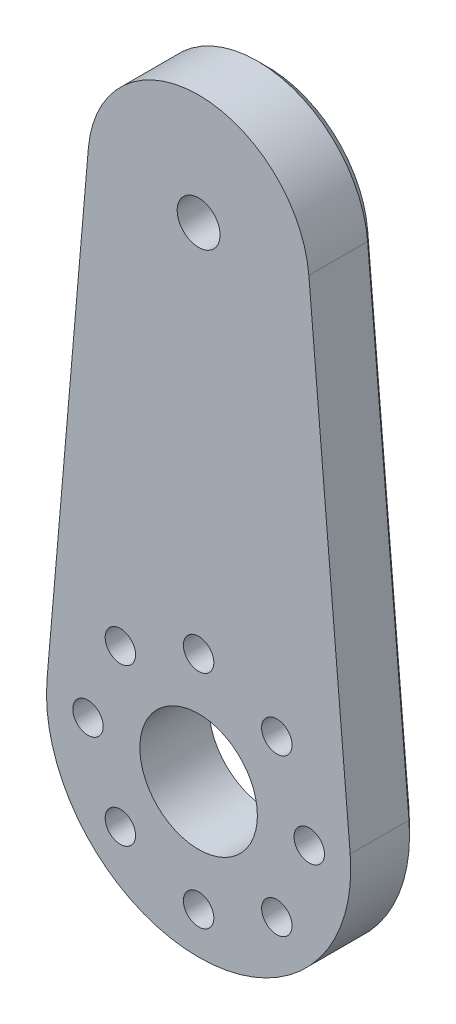
ISO-10303-21;
HEADER;
FILE_DESCRIPTION(('STEP AP214'),'2;1');
FILE_NAME('part.step','',(''),(''),'','','');
FILE_SCHEMA(('AUTOMOTIVE_DESIGN { 1 0 10303 214 1 1 1 1 }'));
ENDSEC;
DATA;
#1=APPLICATION_CONTEXT('core data for automotive mechanical design processes');
#2=APPLICATION_PROTOCOL_DEFINITION('international standard','automotive_design',2000,#1);
#3=PRODUCT_CONTEXT('',#1,'mechanical');
#4=PRODUCT('Part','Part','',(#3));
#5=PRODUCT_RELATED_PRODUCT_CATEGORY('part','',(#4));
#6=PRODUCT_DEFINITION_FORMATION('','',#4);
#7=PRODUCT_DEFINITION_CONTEXT('part definition',#1,'design');
#8=PRODUCT_DEFINITION('design','',#6,#7);
#9=PRODUCT_DEFINITION_SHAPE('','',#8);
#10=(LENGTH_UNIT() NAMED_UNIT(*) SI_UNIT(.MILLI.,.METRE.));
#11=(NAMED_UNIT(*) PLANE_ANGLE_UNIT() SI_UNIT($,.RADIAN.));
#12=(NAMED_UNIT(*) SI_UNIT($,.STERADIAN.) SOLID_ANGLE_UNIT());
#13=UNCERTAINTY_MEASURE_WITH_UNIT(LENGTH_MEASURE(1.E-05),#10,'distance_accuracy_value','');
#14=(GEOMETRIC_REPRESENTATION_CONTEXT(3) GLOBAL_UNCERTAINTY_ASSIGNED_CONTEXT((#13)) GLOBAL_UNIT_ASSIGNED_CONTEXT((#10,
#11,#12)) REPRESENTATION_CONTEXT('',''));
#15=CARTESIAN_POINT('',(0.,0.,0.));
#16=DIRECTION('',(0.,0.,1.));
#17=DIRECTION('',(1.,0.,0.));
#18=AXIS2_PLACEMENT_3D('',#15,#16,#17);
#19=CARTESIAN_POINT('',(-7.11762862032842,-19.3667607447331,5.));
#20=DIRECTION('',(0.,0.,-1.));
#21=DIRECTION('',(-1.,0.,0.));
#22=AXIS2_PLACEMENT_3D('',#19,#20,#21);
#23=CYLINDRICAL_SURFACE('',#22,1.1);
#24=CARTESIAN_POINT('',(-7.11762862032842,-19.3667607447331,5.));
#25=DIRECTION('',(0.,0.,1.));
#26=DIRECTION('',(1.,0.,0.));
#27=AXIS2_PLACEMENT_3D('',#24,#25,#26);
#28=CIRCLE('',#27,1.1);
#29=CARTESIAN_POINT('',(-6.01762862032842,-19.3667607447331,5.));
#30=VERTEX_POINT('',#29);
#31=EDGE_CURVE('E181',#30,#30,#28,.T.);
#32=ORIENTED_EDGE('',*,*,#31,.T.);
#33=EDGE_LOOP('',(#32));
#34=FACE_BOUND('',#33,.T.);
#35=CARTESIAN_POINT('',(-7.11762862032842,-19.3667607447331,2.25));
#36=DIRECTION('',(0.,0.,-1.));
#37=DIRECTION('',(-1.,0.,0.));
#38=AXIS2_PLACEMENT_3D('',#35,#36,#37);
#39=CIRCLE('',#38,1.1);
#40=CARTESIAN_POINT('',(-8.21762862032842,-19.3667607447331,2.25));
#41=VERTEX_POINT('',#40);
#42=EDGE_CURVE('E234',#41,#41,#39,.T.);
#43=ORIENTED_EDGE('',*,*,#42,.T.);
#44=EDGE_LOOP('',(#43));
#45=FACE_BOUND('',#44,.T.);
#46=ADVANCED_FACE('F35',(#34,#45),#23,.F.);
#47=CARTESIAN_POINT('',(-9.46077437083603,-25.0236149942255,5.));
#48=DIRECTION('',(0.,0.,-1.));
#49=DIRECTION('',(-1.,0.,0.));
#50=AXIS2_PLACEMENT_3D('',#47,#48,#49);
#51=CYLINDRICAL_SURFACE('',#50,1.1);
#52=CARTESIAN_POINT('',(-9.46077437083603,-25.0236149942255,5.));
#53=DIRECTION('',(0.,0.,1.));
#54=DIRECTION('',(1.,0.,0.));
#55=AXIS2_PLACEMENT_3D('',#52,#53,#54);
#56=CIRCLE('',#55,1.1);
#57=CARTESIAN_POINT('',(-8.36077437083603,-25.0236149942255,5.));
#58=VERTEX_POINT('',#57);
#59=EDGE_CURVE('E178',#58,#58,#56,.T.);
#60=ORIENTED_EDGE('',*,*,#59,.T.);
#61=EDGE_LOOP('',(#60));
#62=FACE_BOUND('',#61,.T.);
#63=CARTESIAN_POINT('',(-9.46077437083603,-25.0236149942255,2.25));
#64=DIRECTION('',(0.,0.,-1.));
#65=DIRECTION('',(-1.,0.,0.));
#66=AXIS2_PLACEMENT_3D('',#63,#64,#65);
#67=CIRCLE('',#66,1.1);
#68=CARTESIAN_POINT('',(-10.560774370836,-25.0236149942255,2.25));
#69=VERTEX_POINT('',#68);
#70=EDGE_CURVE('E231',#69,#69,#67,.T.);
#71=ORIENTED_EDGE('',*,*,#70,.T.);
#72=EDGE_LOOP('',(#71));
#73=FACE_BOUND('',#72,.T.);
#74=ADVANCED_FACE('F332',(#62,#73),#51,.F.);
#75=CARTESIAN_POINT('',(-15.1176286203284,-27.3667607447331,5.));
#76=DIRECTION('',(0.,0.,-1.));
#77=DIRECTION('',(-1.,0.,0.));
#78=AXIS2_PLACEMENT_3D('',#75,#76,#77);
#79=CYLINDRICAL_SURFACE('',#78,1.1);
#80=CARTESIAN_POINT('',(-15.1176286203284,-27.3667607447331,5.));
#81=DIRECTION('',(0.,0.,1.));
#82=DIRECTION('',(1.,0.,0.));
#83=AXIS2_PLACEMENT_3D('',#80,#81,#82);
#84=CIRCLE('',#83,1.1);
#85=CARTESIAN_POINT('',(-14.0176286203284,-27.3667607447331,5.));
#86=VERTEX_POINT('',#85);
#87=EDGE_CURVE('E175',#86,#86,#84,.T.);
#88=ORIENTED_EDGE('',*,*,#87,.T.);
#89=EDGE_LOOP('',(#88));
#90=FACE_BOUND('',#89,.T.);
#91=CARTESIAN_POINT('',(-15.1176286203284,-27.3667607447331,2.25));
#92=DIRECTION('',(0.,0.,-1.));
#93=DIRECTION('',(-1.,0.,0.));
#94=AXIS2_PLACEMENT_3D('',#91,#92,#93);
#95=CIRCLE('',#94,1.1);
#96=CARTESIAN_POINT('',(-16.2176286203284,-27.3667607447331,2.25));
#97=VERTEX_POINT('',#96);
#98=EDGE_CURVE('E228',#97,#97,#95,.T.);
#99=ORIENTED_EDGE('',*,*,#98,.T.);
#100=EDGE_LOOP('',(#99));
#101=FACE_BOUND('',#100,.T.);
#102=ADVANCED_FACE('F338',(#90,#101),#79,.F.);
#103=CARTESIAN_POINT('',(-20.7744828698208,-25.0236149942255,5.));
#104=DIRECTION('',(0.,0.,-1.));
#105=DIRECTION('',(-1.,0.,0.));
#106=AXIS2_PLACEMENT_3D('',#103,#104,#105);
#107=CYLINDRICAL_SURFACE('',#106,1.1);
#108=CARTESIAN_POINT('',(-20.7744828698208,-25.0236149942255,5.));
#109=DIRECTION('',(0.,0.,1.));
#110=DIRECTION('',(1.,0.,0.));
#111=AXIS2_PLACEMENT_3D('',#108,#109,#110);
#112=CIRCLE('',#111,1.1);
#113=CARTESIAN_POINT('',(-19.6744828698208,-25.0236149942255,5.));
#114=VERTEX_POINT('',#113);
#115=EDGE_CURVE('E172',#114,#114,#112,.T.);
#116=ORIENTED_EDGE('',*,*,#115,.T.);
#117=EDGE_LOOP('',(#116));
#118=FACE_BOUND('',#117,.T.);
#119=CARTESIAN_POINT('',(-20.7744828698208,-25.0236149942255,2.25));
#120=DIRECTION('',(0.,0.,-1.));
#121=DIRECTION('',(-1.,0.,0.));
#122=AXIS2_PLACEMENT_3D('',#119,#120,#121);
#123=CIRCLE('',#122,1.1);
#124=CARTESIAN_POINT('',(-21.8744828698208,-25.0236149942255,2.25));
#125=VERTEX_POINT('',#124);
#126=EDGE_CURVE('E225',#125,#125,#123,.T.);
#127=ORIENTED_EDGE('',*,*,#126,.T.);
#128=EDGE_LOOP('',(#127));
#129=FACE_BOUND('',#128,.T.);
#130=ADVANCED_FACE('F724',(#118,#129),#107,.F.);
#131=CARTESIAN_POINT('',(-23.1176286203284,-19.3667607447331,5.));
#132=DIRECTION('',(0.,0.,-1.));
#133=DIRECTION('',(-1.,0.,0.));
#134=AXIS2_PLACEMENT_3D('',#131,#132,#133);
#135=CYLINDRICAL_SURFACE('',#134,1.1);
#136=CARTESIAN_POINT('',(-23.1176286203284,-19.3667607447331,5.));
#137=DIRECTION('',(0.,0.,1.));
#138=DIRECTION('',(1.,0.,0.));
#139=AXIS2_PLACEMENT_3D('',#136,#137,#138);
#140=CIRCLE('',#139,1.1);
#141=CARTESIAN_POINT('',(-22.0176286203284,-19.3667607447331,5.));
#142=VERTEX_POINT('',#141);
#143=EDGE_CURVE('E169',#142,#142,#140,.T.);
#144=ORIENTED_EDGE('',*,*,#143,.T.);
#145=EDGE_LOOP('',(#144));
#146=FACE_BOUND('',#145,.T.);
#147=CARTESIAN_POINT('',(-23.1176286203284,-19.3667607447331,2.25));
#148=DIRECTION('',(0.,0.,-1.));
#149=DIRECTION('',(-1.,0.,0.));
#150=AXIS2_PLACEMENT_3D('',#147,#148,#149);
#151=CIRCLE('',#150,1.1);
#152=CARTESIAN_POINT('',(-24.2176286203284,-19.3667607447331,2.25));
#153=VERTEX_POINT('',#152);
#154=EDGE_CURVE('E222',#153,#153,#151,.T.);
#155=ORIENTED_EDGE('',*,*,#154,.T.);
#156=EDGE_LOOP('',(#155));
#157=FACE_BOUND('',#156,.T.);
#158=ADVANCED_FACE('F733',(#146,#157),#135,.F.);
#159=CARTESIAN_POINT('',(-20.7744828698208,-13.7099064952407,5.));
#160=DIRECTION('',(0.,0.,-1.));
#161=DIRECTION('',(-1.,0.,0.));
#162=AXIS2_PLACEMENT_3D('',#159,#160,#161);
#163=CYLINDRICAL_SURFACE('',#162,1.1);
#164=CARTESIAN_POINT('',(-20.7744828698208,-13.7099064952407,5.));
#165=DIRECTION('',(0.,0.,1.));
#166=DIRECTION('',(1.,0.,0.));
#167=AXIS2_PLACEMENT_3D('',#164,#165,#166);
#168=CIRCLE('',#167,1.1);
#169=CARTESIAN_POINT('',(-19.6744828698208,-13.7099064952407,5.));
#170=VERTEX_POINT('',#169);
#171=EDGE_CURVE('E166',#170,#170,#168,.T.);
#172=ORIENTED_EDGE('',*,*,#171,.T.);
#173=EDGE_LOOP('',(#172));
#174=FACE_BOUND('',#173,.T.);
#175=CARTESIAN_POINT('',(-20.7744828698208,-13.7099064952407,2.25));
#176=DIRECTION('',(0.,0.,-1.));
#177=DIRECTION('',(-1.,0.,0.));
#178=AXIS2_PLACEMENT_3D('',#175,#176,#177);
#179=CIRCLE('',#178,1.1);
#180=CARTESIAN_POINT('',(-21.8744828698208,-13.7099064952407,2.25));
#181=VERTEX_POINT('',#180);
#182=EDGE_CURVE('E219',#181,#181,#179,.T.);
#183=ORIENTED_EDGE('',*,*,#182,.T.);
#184=EDGE_LOOP('',(#183));
#185=FACE_BOUND('',#184,.T.);
#186=ADVANCED_FACE('F743',(#174,#185),#163,.F.);
#187=CARTESIAN_POINT('',(-15.1176286203284,-11.3667607447331,5.));
#188=DIRECTION('',(0.,0.,-1.));
#189=DIRECTION('',(-1.,0.,0.));
#190=AXIS2_PLACEMENT_3D('',#187,#188,#189);
#191=CYLINDRICAL_SURFACE('',#190,1.1);
#192=CARTESIAN_POINT('',(-15.1176286203284,-11.3667607447331,5.));
#193=DIRECTION('',(0.,0.,1.));
#194=DIRECTION('',(1.,0.,0.));
#195=AXIS2_PLACEMENT_3D('',#192,#193,#194);
#196=CIRCLE('',#195,1.1);
#197=CARTESIAN_POINT('',(-14.0176286203284,-11.3667607447331,5.));
#198=VERTEX_POINT('',#197);
#199=EDGE_CURVE('E163',#198,#198,#196,.T.);
#200=ORIENTED_EDGE('',*,*,#199,.T.);
#201=EDGE_LOOP('',(#200));
#202=FACE_BOUND('',#201,.T.);
#203=CARTESIAN_POINT('',(-15.1176286203284,-11.3667607447331,2.25));
#204=DIRECTION('',(0.,0.,-1.));
#205=DIRECTION('',(-1.,0.,0.));
#206=AXIS2_PLACEMENT_3D('',#203,#204,#205);
#207=CIRCLE('',#206,1.1);
#208=CARTESIAN_POINT('',(-16.2176286203284,-11.3667607447331,2.25));
#209=VERTEX_POINT('',#208);
#210=EDGE_CURVE('E215',#209,#209,#207,.T.);
#211=ORIENTED_EDGE('',*,*,#210,.T.);
#212=EDGE_LOOP('',(#211));
#213=FACE_BOUND('',#212,.T.);
#214=ADVANCED_FACE('F418',(#202,#213),#191,.F.);
#215=CARTESIAN_POINT('',(-9.46077437083604,-13.7099064952407,5.));
#216=DIRECTION('',(0.,0.,-1.));
#217=DIRECTION('',(-1.,0.,0.));
#218=AXIS2_PLACEMENT_3D('',#215,#216,#217);
#219=CYLINDRICAL_SURFACE('',#218,1.1);
#220=CARTESIAN_POINT('',(-9.46077437083604,-13.7099064952407,5.));
#221=DIRECTION('',(0.,0.,1.));
#222=DIRECTION('',(1.,0.,0.));
#223=AXIS2_PLACEMENT_3D('',#220,#221,#222);
#224=CIRCLE('',#223,1.1);
#225=CARTESIAN_POINT('',(-8.36077437083604,-13.7099064952407,5.));
#226=VERTEX_POINT('',#225);
#227=EDGE_CURVE('E155',#226,#226,#224,.T.);
#228=ORIENTED_EDGE('',*,*,#227,.T.);
#229=EDGE_LOOP('',(#228));
#230=FACE_BOUND('',#229,.T.);
#231=CARTESIAN_POINT('',(-9.46077437083604,-13.7099064952407,2.25));
#232=DIRECTION('',(0.,0.,-1.));
#233=DIRECTION('',(-1.,0.,0.));
#234=AXIS2_PLACEMENT_3D('',#231,#232,#233);
#235=CIRCLE('',#234,1.1);
#236=CARTESIAN_POINT('',(-10.560774370836,-13.7099064952407,2.25));
#237=VERTEX_POINT('',#236);
#238=EDGE_CURVE('E212',#237,#237,#235,.T.);
#239=ORIENTED_EDGE('',*,*,#238,.T.);
#240=EDGE_LOOP('',(#239));
#241=FACE_BOUND('',#240,.T.);
#242=ADVANCED_FACE('F360',(#230,#241),#219,.F.);
#243=CARTESIAN_POINT('',(-15.1176286203284,15.6332392552669,0.));
#244=DIRECTION('',(0.,0.,1.));
#245=DIRECTION('',(1.,0.,0.));
#246=AXIS2_PLACEMENT_3D('',#243,#244,#245);
#247=PLANE('',#246);
#248=CARTESIAN_POINT('',(-15.1176286203284,-19.3667607447331,0.));
#249=DIRECTION('',(0.,0.,1.));
#250=DIRECTION('',(1.,0.,0.));
#251=AXIS2_PLACEMENT_3D('',#248,#249,#250);
#252=CIRCLE('',#251,10.25);
#253=CARTESIAN_POINT('',(-4.90535109546171,-18.4881893161617,0.));
#254=VERTEX_POINT('',#253);
#255=CARTESIAN_POINT('',(-25.3299061451951,-18.4881893161617,0.));
#256=VERTEX_POINT('',#255);
#257=EDGE_CURVE('E244',#254,#256,#252,.F.);
#258=ORIENTED_EDGE('',*,*,#257,.T.);
#259=DIRECTION('',(0.0857142857142855,0.996319758523583,0.));
#260=VECTOR('',#259,1.);
#261=CARTESIAN_POINT('',(-22.3409468696244,16.2546678266955,0.));
#262=LINE('',#261,#260);
#263=CARTESIAN_POINT('',(-22.3409468696244,16.2546678266955,0.));
#264=VERTEX_POINT('',#263);
#265=EDGE_CURVE('E246',#256,#264,#262,.T.);
#266=ORIENTED_EDGE('',*,*,#265,.T.);
#267=CARTESIAN_POINT('',(-15.1176286203284,15.6332392552669,0.));
#268=DIRECTION('',(0.,0.,1.));
#269=DIRECTION('',(1.,0.,0.));
#270=AXIS2_PLACEMENT_3D('',#267,#268,#269);
#271=CIRCLE('',#270,7.24999999999999);
#272=CARTESIAN_POINT('',(-7.89431037103246,16.2546678266955,0.));
#273=VERTEX_POINT('',#272);
#274=EDGE_CURVE('E242',#264,#273,#271,.F.);
#275=ORIENTED_EDGE('',*,*,#274,.T.);
#276=DIRECTION('',(0.0857142857142858,-0.996319758523583,0.));
#277=VECTOR('',#276,1.);
#278=CARTESIAN_POINT('',(-7.89431037103246,16.2546678266955,0.));
#279=LINE('',#278,#277);
#280=EDGE_CURVE('E240',#273,#254,#279,.T.);
#281=ORIENTED_EDGE('',*,*,#280,.T.);
#282=EDGE_LOOP('',(#258,#266,#275,#281));
#283=FACE_BOUND('',#282,.T.);
#284=CARTESIAN_POINT('',(-20.7744828698208,-13.7099064952407,0.));
#285=DIRECTION('',(0.,0.,-1.));
#286=DIRECTION('',(-1.,0.,0.));
#287=AXIS2_PLACEMENT_3D('',#284,#285,#286);
#288=CIRCLE('',#287,1.75);
#289=CARTESIAN_POINT('',(-22.5244828698208,-13.7099064952407,0.));
#290=VERTEX_POINT('',#289);
#291=EDGE_CURVE('E260',#290,#290,#288,.T.);
#292=ORIENTED_EDGE('',*,*,#291,.F.);
#293=EDGE_LOOP('',(#292));
#294=FACE_BOUND('',#293,.T.);
#295=CARTESIAN_POINT('',(-15.1176286203284,-11.3667607447331,0.));
#296=DIRECTION('',(0.,0.,-1.));
#297=DIRECTION('',(-1.,0.,0.));
#298=AXIS2_PLACEMENT_3D('',#295,#296,#297);
#299=CIRCLE('',#298,1.75);
#300=CARTESIAN_POINT('',(-16.8676286203284,-11.3667607447331,0.));
#301=VERTEX_POINT('',#300);
#302=EDGE_CURVE('E271',#301,#301,#299,.T.);
#303=ORIENTED_EDGE('',*,*,#302,.F.);
#304=EDGE_LOOP('',(#303));
#305=FACE_BOUND('',#304,.T.);
#306=CARTESIAN_POINT('',(-9.46077437083604,-13.7099064952407,0.));
#307=DIRECTION('',(0.,0.,-1.));
#308=DIRECTION('',(-1.,0.,0.));
#309=AXIS2_PLACEMENT_3D('',#306,#307,#308);
#310=CIRCLE('',#309,1.75);
#311=CARTESIAN_POINT('',(-11.210774370836,-13.7099064952407,0.));
#312=VERTEX_POINT('',#311);
#313=EDGE_CURVE('E433',#312,#312,#310,.T.);
#314=ORIENTED_EDGE('',*,*,#313,.F.);
#315=EDGE_LOOP('',(#314));
#316=FACE_BOUND('',#315,.T.);
#317=CARTESIAN_POINT('',(-7.11762862032842,-19.3667607447331,0.));
#318=DIRECTION('',(0.,0.,-1.));
#319=DIRECTION('',(-1.,0.,0.));
#320=AXIS2_PLACEMENT_3D('',#317,#318,#319);
#321=CIRCLE('',#320,1.75);
#322=CARTESIAN_POINT('',(-8.86762862032842,-19.3667607447331,0.));
#323=VERTEX_POINT('',#322);
#324=EDGE_CURVE('E432',#323,#323,#321,.T.);
#325=ORIENTED_EDGE('',*,*,#324,.F.);
#326=EDGE_LOOP('',(#325));
#327=FACE_BOUND('',#326,.T.);
#328=CARTESIAN_POINT('',(-9.46077437083603,-25.0236149942255,0.));
#329=DIRECTION('',(0.,0.,-1.));
#330=DIRECTION('',(-1.,0.,0.));
#331=AXIS2_PLACEMENT_3D('',#328,#329,#330);
#332=CIRCLE('',#331,1.75);
#333=CARTESIAN_POINT('',(-11.210774370836,-25.0236149942255,0.));
#334=VERTEX_POINT('',#333);
#335=EDGE_CURVE('E456',#334,#334,#332,.T.);
#336=ORIENTED_EDGE('',*,*,#335,.F.);
#337=EDGE_LOOP('',(#336));
#338=FACE_BOUND('',#337,.T.);
#339=CARTESIAN_POINT('',(-15.1176286203284,-27.3667607447331,0.));
#340=DIRECTION('',(0.,0.,-1.));
#341=DIRECTION('',(-1.,0.,0.));
#342=AXIS2_PLACEMENT_3D('',#339,#340,#341);
#343=CIRCLE('',#342,1.75);
#344=CARTESIAN_POINT('',(-16.8676286203284,-27.3667607447331,0.));
#345=VERTEX_POINT('',#344);
#346=EDGE_CURVE('E460',#345,#345,#343,.T.);
#347=ORIENTED_EDGE('',*,*,#346,.F.);
#348=EDGE_LOOP('',(#347));
#349=FACE_BOUND('',#348,.T.);
#350=CARTESIAN_POINT('',(-20.7744828698208,-25.0236149942255,0.));
#351=DIRECTION('',(0.,0.,-1.));
#352=DIRECTION('',(-1.,0.,0.));
#353=AXIS2_PLACEMENT_3D('',#350,#351,#352);
#354=CIRCLE('',#353,1.74999999999999);
#355=CARTESIAN_POINT('',(-22.5244828698208,-25.0236149942255,0.));
#356=VERTEX_POINT('',#355);
#357=EDGE_CURVE('E464',#356,#356,#354,.T.);
#358=ORIENTED_EDGE('',*,*,#357,.F.);
#359=EDGE_LOOP('',(#358));
#360=FACE_BOUND('',#359,.T.);
#361=CARTESIAN_POINT('',(-23.1176286203284,-19.3667607447331,0.));
#362=DIRECTION('',(0.,0.,-1.));
#363=DIRECTION('',(-1.,0.,0.));
#364=AXIS2_PLACEMENT_3D('',#361,#362,#363);
#365=CIRCLE('',#364,1.75);
#366=CARTESIAN_POINT('',(-24.8676286203284,-19.3667607447331,0.));
#367=VERTEX_POINT('',#366);
#368=EDGE_CURVE('E277',#367,#367,#365,.T.);
#369=ORIENTED_EDGE('',*,*,#368,.F.);
#370=EDGE_LOOP('',(#369));
#371=FACE_BOUND('',#370,.T.);
#372=CARTESIAN_POINT('',(-15.1176286203284,-19.3667607447331,0.));
#373=DIRECTION('',(0.,0.,1.));
#374=DIRECTION('',(1.,0.,0.));
#375=AXIS2_PLACEMENT_3D('',#372,#373,#374);
#376=CIRCLE('',#375,4.25);
#377=CARTESIAN_POINT('',(-10.8676286203284,-19.3667607447331,0.));
#378=VERTEX_POINT('',#377);
#379=EDGE_CURVE('E184',#378,#378,#376,.T.);
#380=ORIENTED_EDGE('',*,*,#379,.T.);
#381=EDGE_LOOP('',(#380));
#382=FACE_BOUND('',#381,.T.);
#383=DIRECTION('',(1.,0.,0.));
#384=VECTOR('',#383,1.);
#385=CARTESIAN_POINT('',(-16.7053418605999,12.8832392552669,0.));
#386=LINE('',#385,#384);
#387=CARTESIAN_POINT('',(-16.7053418605999,12.8832392552669,0.));
#388=VERTEX_POINT('',#387);
#389=CARTESIAN_POINT('',(-13.529915380057,12.8832392552669,0.));
#390=VERTEX_POINT('',#389);
#391=EDGE_CURVE('E237',#388,#390,#386,.T.);
#392=ORIENTED_EDGE('',*,*,#391,.T.);
#393=DIRECTION('',(0.5,0.866025403784439,0.));
#394=VECTOR('',#393,1.);
#395=CARTESIAN_POINT('',(-13.529915380057,12.8832392552669,0.));
#396=LINE('',#395,#394);
#397=CARTESIAN_POINT('',(-11.9422021397855,15.6332392552669,0.));
#398=VERTEX_POINT('',#397);
#399=EDGE_CURVE('E150',#390,#398,#396,.T.);
#400=ORIENTED_EDGE('',*,*,#399,.T.);
#401=DIRECTION('',(-0.5,0.866025403784439,0.));
#402=VECTOR('',#401,1.);
#403=CARTESIAN_POINT('',(-11.9422021397855,15.6332392552669,0.));
#404=LINE('',#403,#402);
#405=CARTESIAN_POINT('',(-13.529915380057,18.3832392552669,0.));
#406=VERTEX_POINT('',#405);
#407=EDGE_CURVE('E290',#398,#406,#404,.T.);
#408=ORIENTED_EDGE('',*,*,#407,.T.);
#409=DIRECTION('',(-1.,0.,0.));
#410=VECTOR('',#409,1.);
#411=CARTESIAN_POINT('',(-13.529915380057,18.3832392552669,0.));
#412=LINE('',#411,#410);
#413=CARTESIAN_POINT('',(-16.7053418605999,18.3832392552669,0.));
#414=VERTEX_POINT('',#413);
#415=EDGE_CURVE('E293',#406,#414,#412,.T.);
#416=ORIENTED_EDGE('',*,*,#415,.T.);
#417=DIRECTION('',(-0.5,-0.866025403784439,0.));
#418=VECTOR('',#417,1.);
#419=CARTESIAN_POINT('',(-16.7053418605999,18.3832392552669,0.));
#420=LINE('',#419,#418);
#421=CARTESIAN_POINT('',(-18.2930551008714,15.6332392552669,0.));
#422=VERTEX_POINT('',#421);
#423=EDGE_CURVE('E296',#414,#422,#420,.T.);
#424=ORIENTED_EDGE('',*,*,#423,.T.);
#425=DIRECTION('',(0.500000000000001,-0.866025403784438,0.));
#426=VECTOR('',#425,1.);
#427=CARTESIAN_POINT('',(-18.2930551008714,15.6332392552669,0.));
#428=LINE('',#427,#426);
#429=EDGE_CURVE('E146',#422,#388,#428,.T.);
#430=ORIENTED_EDGE('',*,*,#429,.T.);
#431=EDGE_LOOP('',(#392,#400,#408,#416,#424,#430));
#432=FACE_BOUND('',#431,.T.);
#433=ADVANCED_FACE('F315',(#283,#294,#305,#316,#327,#338,#349,#360,#371,#382,#432),#247,.F.);
#434=CARTESIAN_POINT('',(-15.1176286203284,15.6332392552669,5.));
#435=DIRECTION('',(0.,0.,1.));
#436=DIRECTION('',(1.,0.,0.));
#437=AXIS2_PLACEMENT_3D('',#434,#435,#436);
#438=PLANE('',#437);
#439=ORIENTED_EDGE('',*,*,#199,.F.);
#440=EDGE_LOOP('',(#439));
#441=FACE_BOUND('',#440,.T.);
#442=ORIENTED_EDGE('',*,*,#143,.F.);
#443=EDGE_LOOP('',(#442));
#444=FACE_BOUND('',#443,.T.);
#445=ORIENTED_EDGE('',*,*,#87,.F.);
#446=EDGE_LOOP('',(#445));
#447=FACE_BOUND('',#446,.T.);
#448=ORIENTED_EDGE('',*,*,#31,.F.);
#449=EDGE_LOOP('',(#448));
#450=FACE_BOUND('',#449,.T.);
#451=CARTESIAN_POINT('',(-15.1176286203284,15.6332392552669,5.));
#452=DIRECTION('',(0.,0.,1.));
#453=DIRECTION('',(1.,0.,0.));
#454=AXIS2_PLACEMENT_3D('',#451,#452,#453);
#455=CIRCLE('',#454,1.55);
#456=CARTESIAN_POINT('',(-13.5676286203284,15.6332392552669,5.));
#457=VERTEX_POINT('',#456);
#458=EDGE_CURVE('E188',#457,#457,#455,.T.);
#459=ORIENTED_EDGE('',*,*,#458,.F.);
#460=EDGE_LOOP('',(#459));
#461=FACE_BOUND('',#460,.T.);
#462=CARTESIAN_POINT('',(-15.1176286203284,15.6332392552669,5.));
#463=DIRECTION('',(0.,0.,1.));
#464=DIRECTION('',(1.,0.,0.));
#465=AXIS2_PLACEMENT_3D('',#462,#463,#464);
#466=CIRCLE('',#465,8.);
#467=CARTESIAN_POINT('',(-7.14707055213976,16.3189535409812,5.));
#468=VERTEX_POINT('',#467);
#469=CARTESIAN_POINT('',(-23.0881866885171,16.3189535409812,5.));
#470=VERTEX_POINT('',#469);
#471=EDGE_CURVE('E193',#468,#470,#466,.T.);
#472=ORIENTED_EDGE('',*,*,#471,.T.);
#473=DIRECTION('',(-0.0857142857142855,-0.996319758523583,0.));
#474=VECTOR('',#473,1.);
#475=CARTESIAN_POINT('',(-23.0881866885171,16.3189535409812,5.));
#476=LINE('',#475,#474);
#477=CARTESIAN_POINT('',(-26.0771459640878,-18.4239036018759,5.));
#478=VERTEX_POINT('',#477);
#479=EDGE_CURVE('E196',#470,#478,#476,.T.);
#480=ORIENTED_EDGE('',*,*,#479,.T.);
#481=CARTESIAN_POINT('',(-15.1176286203284,-19.3667607447331,5.));
#482=DIRECTION('',(0.,0.,1.));
#483=DIRECTION('',(1.,0.,0.));
#484=AXIS2_PLACEMENT_3D('',#481,#482,#483);
#485=CIRCLE('',#484,11.);
#486=CARTESIAN_POINT('',(-4.15811127656901,-18.4239036018759,5.));
#487=VERTEX_POINT('',#486);
#488=EDGE_CURVE('E198',#478,#487,#485,.T.);
#489=ORIENTED_EDGE('',*,*,#488,.T.);
#490=DIRECTION('',(-0.0857142857142858,0.996319758523583,0.));
#491=VECTOR('',#490,1.);
#492=CARTESIAN_POINT('',(-7.14707055213976,16.3189535409812,5.));
#493=LINE('',#492,#491);
#494=EDGE_CURVE('E200',#487,#468,#493,.T.);
#495=ORIENTED_EDGE('',*,*,#494,.T.);
#496=EDGE_LOOP('',(#472,#480,#489,#495));
#497=FACE_BOUND('',#496,.T.);
#498=CARTESIAN_POINT('',(-15.1176286203284,-19.3667607447331,5.));
#499=DIRECTION('',(0.,0.,1.));
#500=DIRECTION('',(1.,0.,0.));
#501=AXIS2_PLACEMENT_3D('',#498,#499,#500);
#502=CIRCLE('',#501,4.25);
#503=CARTESIAN_POINT('',(-10.8676286203284,-19.3667607447331,5.));
#504=VERTEX_POINT('',#503);
#505=EDGE_CURVE('E185',#504,#504,#502,.T.);
#506=ORIENTED_EDGE('',*,*,#505,.F.);
#507=EDGE_LOOP('',(#506));
#508=FACE_BOUND('',#507,.T.);
#509=ORIENTED_EDGE('',*,*,#59,.F.);
#510=EDGE_LOOP('',(#509));
#511=FACE_BOUND('',#510,.T.);
#512=ORIENTED_EDGE('',*,*,#115,.F.);
#513=EDGE_LOOP('',(#512));
#514=FACE_BOUND('',#513,.T.);
#515=ORIENTED_EDGE('',*,*,#171,.F.);
#516=EDGE_LOOP('',(#515));
#517=FACE_BOUND('',#516,.T.);
#518=ORIENTED_EDGE('',*,*,#227,.F.);
#519=EDGE_LOOP('',(#518));
#520=FACE_BOUND('',#519,.T.);
#521=ADVANCED_FACE('F353',(#441,#444,#447,#450,#461,#497,#508,#511,#514,#517,#520),#438,.T.);
#522=CARTESIAN_POINT('',(-15.1176286203284,15.6332392552669,5.));
#523=DIRECTION('',(0.,0.,-1.));
#524=DIRECTION('',(-1.,0.,0.));
#525=AXIS2_PLACEMENT_3D('',#522,#523,#524);
#526=CYLINDRICAL_SURFACE('',#525,8.);
#527=DIRECTION('',(0.,0.,-1.));
#528=VECTOR('',#527,1.);
#529=CARTESIAN_POINT('',(-7.14707055213976,16.3189535409812,5.));
#530=LINE('',#529,#528);
#531=CARTESIAN_POINT('',(-7.14707055213976,16.3189535409812,0.750000000000001));
#532=VERTEX_POINT('',#531);
#533=EDGE_CURVE('E202',#468,#532,#530,.T.);
#534=ORIENTED_EDGE('',*,*,#533,.T.);
#535=CARTESIAN_POINT('',(-15.1176286203284,15.6332392552669,0.750000000000001));
#536=DIRECTION('',(0.,0.,1.));
#537=DIRECTION('',(1.,0.,0.));
#538=AXIS2_PLACEMENT_3D('',#535,#536,#537);
#539=CIRCLE('',#538,8.);
#540=CARTESIAN_POINT('',(-23.0881866885171,16.3189535409812,0.750000000000001));
#541=VERTEX_POINT('',#540);
#542=EDGE_CURVE('E44',#532,#541,#539,.T.);
#543=ORIENTED_EDGE('',*,*,#542,.T.);
#544=DIRECTION('',(0.,0.,-1.));
#545=VECTOR('',#544,1.);
#546=CARTESIAN_POINT('',(-23.0881866885171,16.3189535409812,5.));
#547=LINE('',#546,#545);
#548=EDGE_CURVE('E208',#470,#541,#547,.T.);
#549=ORIENTED_EDGE('',*,*,#548,.F.);
#550=ORIENTED_EDGE('',*,*,#471,.F.);
#551=EDGE_LOOP('',(#534,#543,#549,#550));
#552=FACE_BOUND('',#551,.T.);
#553=ADVANCED_FACE('F356',(#552),#526,.T.);
#554=CARTESIAN_POINT('',(-23.0881866885171,16.3189535409812,5.));
#555=DIRECTION('',(0.996319758523583,-0.0857142857142855,0.));
#556=DIRECTION('',(0.0857142857142855,0.996319758523583,0.));
#557=AXIS2_PLACEMENT_3D('',#554,#555,#556);
#558=PLANE('',#557);
#559=ORIENTED_EDGE('',*,*,#548,.T.);
#560=DIRECTION('',(-0.0857142857142855,-0.996319758523583,0.));
#561=VECTOR('',#560,1.);
#562=CARTESIAN_POINT('',(-23.0881866885171,16.3189535409812,0.750000000000002));
#563=LINE('',#562,#561);
#564=CARTESIAN_POINT('',(-26.0771459640878,-18.4239036018759,0.750000000000001));
#565=VERTEX_POINT('',#564);
#566=EDGE_CURVE('E210',#541,#565,#563,.T.);
#567=ORIENTED_EDGE('',*,*,#566,.T.);
#568=DIRECTION('',(0.,0.,-1.));
#569=VECTOR('',#568,1.);
#570=CARTESIAN_POINT('',(-26.0771459640878,-18.4239036018759,5.));
#571=LINE('',#570,#569);
#572=EDGE_CURVE('E206',#478,#565,#571,.T.);
#573=ORIENTED_EDGE('',*,*,#572,.F.);
#574=ORIENTED_EDGE('',*,*,#479,.F.);
#575=EDGE_LOOP('',(#559,#567,#573,#574));
#576=FACE_BOUND('',#575,.T.);
#577=ADVANCED_FACE('F367',(#576),#558,.F.);
#578=CARTESIAN_POINT('',(-15.1176286203284,-19.3667607447331,5.));
#579=DIRECTION('',(0.,0.,-1.));
#580=DIRECTION('',(-1.,0.,0.));
#581=AXIS2_PLACEMENT_3D('',#578,#579,#580);
#582=CYLINDRICAL_SURFACE('',#581,11.);
#583=ORIENTED_EDGE('',*,*,#572,.T.);
#584=CARTESIAN_POINT('',(-15.1176286203284,-19.3667607447331,0.750000000000001));
#585=DIRECTION('',(0.,0.,1.));
#586=DIRECTION('',(1.,0.,0.));
#587=AXIS2_PLACEMENT_3D('',#584,#585,#586);
#588=CIRCLE('',#587,11.);
#589=CARTESIAN_POINT('',(-4.15811127656901,-18.4239036018759,0.750000000000001));
#590=VERTEX_POINT('',#589);
#591=EDGE_CURVE('E58',#565,#590,#588,.T.);
#592=ORIENTED_EDGE('',*,*,#591,.T.);
#593=DIRECTION('',(0.,0.,-1.));
#594=VECTOR('',#593,1.);
#595=CARTESIAN_POINT('',(-4.15811127656901,-18.4239036018759,5.));
#596=LINE('',#595,#594);
#597=EDGE_CURVE('E204',#487,#590,#596,.T.);
#598=ORIENTED_EDGE('',*,*,#597,.F.);
#599=ORIENTED_EDGE('',*,*,#488,.F.);
#600=EDGE_LOOP('',(#583,#592,#598,#599));
#601=FACE_BOUND('',#600,.T.);
#602=ADVANCED_FACE('F364',(#601),#582,.T.);
#603=CARTESIAN_POINT('',(-7.14707055213976,16.3189535409812,5.));
#604=DIRECTION('',(-0.996319758523583,-0.0857142857142858,0.));
#605=DIRECTION('',(0.0857142857142858,-0.996319758523583,0.));
#606=AXIS2_PLACEMENT_3D('',#603,#604,#605);
#607=PLANE('',#606);
#608=ORIENTED_EDGE('',*,*,#597,.T.);
#609=DIRECTION('',(-0.0857142857142858,0.996319758523583,0.));
#610=VECTOR('',#609,1.);
#611=CARTESIAN_POINT('',(-7.14707055213976,16.3189535409812,0.750000000000001));
#612=LINE('',#611,#610);
#613=EDGE_CURVE('E11',#590,#532,#612,.T.);
#614=ORIENTED_EDGE('',*,*,#613,.T.);
#615=ORIENTED_EDGE('',*,*,#533,.F.);
#616=ORIENTED_EDGE('',*,*,#494,.F.);
#617=EDGE_LOOP('',(#608,#614,#615,#616));
#618=FACE_BOUND('',#617,.T.);
#619=ADVANCED_FACE('F351',(#618),#607,.F.);
#620=CARTESIAN_POINT('',(-15.1176286203284,15.6332392552669,5.));
#621=DIRECTION('',(0.,0.,-1.));
#622=DIRECTION('',(-1.,0.,0.));
#623=AXIS2_PLACEMENT_3D('',#620,#621,#622);
#624=CYLINDRICAL_SURFACE('',#623,1.55);
#625=CARTESIAN_POINT('',(-15.1176286203284,15.6332392552669,2.));
#626=DIRECTION('',(0.,0.,1.));
#627=DIRECTION('',(1.,0.,0.));
#628=AXIS2_PLACEMENT_3D('',#625,#626,#627);
#629=CIRCLE('',#628,1.55);
#630=CARTESIAN_POINT('',(-13.5676286203284,15.6332392552669,2.));
#631=VERTEX_POINT('',#630);
#632=EDGE_CURVE('E151',#631,#631,#629,.T.);
#633=ORIENTED_EDGE('',*,*,#632,.F.);
#634=EDGE_LOOP('',(#633));
#635=FACE_BOUND('',#634,.T.);
#636=ORIENTED_EDGE('',*,*,#458,.T.);
#637=EDGE_LOOP('',(#636));
#638=FACE_BOUND('',#637,.T.);
#639=ADVANCED_FACE('F347',(#635,#638),#624,.F.);
#640=CARTESIAN_POINT('',(-15.1176286203284,-19.3667607447331,5.));
#641=DIRECTION('',(0.,0.,-1.));
#642=DIRECTION('',(-1.,0.,0.));
#643=AXIS2_PLACEMENT_3D('',#640,#641,#642);
#644=CYLINDRICAL_SURFACE('',#643,4.25);
#645=ORIENTED_EDGE('',*,*,#505,.T.);
#646=EDGE_LOOP('',(#645));
#647=FACE_BOUND('',#646,.T.);
#648=ORIENTED_EDGE('',*,*,#379,.F.);
#649=EDGE_LOOP('',(#648));
#650=FACE_BOUND('',#649,.T.);
#651=ADVANCED_FACE('F344',(#647,#650),#644,.F.);
#652=CARTESIAN_POINT('',(-16.7053418605999,12.8832392552669,2.));
#653=DIRECTION('',(0.,1.,0.));
#654=DIRECTION('',(0.,0.,1.));
#655=AXIS2_PLACEMENT_3D('',#652,#653,#654);
#656=PLANE('',#655);
#657=ORIENTED_EDGE('',*,*,#391,.F.);
#658=DIRECTION('',(0.,0.,-1.));
#659=VECTOR('',#658,1.);
#660=CARTESIAN_POINT('',(-16.7053418605999,12.8832392552669,2.));
#661=LINE('',#660,#659);
#662=CARTESIAN_POINT('',(-16.7053418605999,12.8832392552669,2.));
#663=VERTEX_POINT('',#662);
#664=EDGE_CURVE('E145',#663,#388,#661,.T.);
#665=ORIENTED_EDGE('',*,*,#664,.F.);
#666=DIRECTION('',(1.,0.,0.));
#667=VECTOR('',#666,1.);
#668=CARTESIAN_POINT('',(-16.7053418605999,12.8832392552669,2.));
#669=LINE('',#668,#667);
#670=CARTESIAN_POINT('',(-13.529915380057,12.8832392552669,2.));
#671=VERTEX_POINT('',#670);
#672=EDGE_CURVE('E131',#663,#671,#669,.T.);
#673=ORIENTED_EDGE('',*,*,#672,.T.);
#674=DIRECTION('',(0.,0.,-1.));
#675=VECTOR('',#674,1.);
#676=CARTESIAN_POINT('',(-13.529915380057,12.8832392552669,2.));
#677=LINE('',#676,#675);
#678=EDGE_CURVE('E142',#671,#390,#677,.T.);
#679=ORIENTED_EDGE('',*,*,#678,.T.);
#680=EDGE_LOOP('',(#657,#665,#673,#679));
#681=FACE_BOUND('',#680,.T.);
#682=ADVANCED_FACE('F141',(#681),#656,.T.);
#683=CARTESIAN_POINT('',(-13.529915380057,12.8832392552669,2.));
#684=DIRECTION('',(-0.866025403784439,0.5,0.));
#685=DIRECTION('',(-0.5,-0.866025403784439,0.));
#686=AXIS2_PLACEMENT_3D('',#683,#684,#685);
#687=PLANE('',#686);
#688=ORIENTED_EDGE('',*,*,#399,.F.);
#689=ORIENTED_EDGE('',*,*,#678,.F.);
#690=DIRECTION('',(0.5,0.866025403784439,0.));
#691=VECTOR('',#690,1.);
#692=CARTESIAN_POINT('',(-13.529915380057,12.8832392552669,2.));
#693=LINE('',#692,#691);
#694=CARTESIAN_POINT('',(-11.9422021397855,15.6332392552669,2.));
#695=VERTEX_POINT('',#694);
#696=EDGE_CURVE('E127',#671,#695,#693,.T.);
#697=ORIENTED_EDGE('',*,*,#696,.T.);
#698=DIRECTION('',(0.,0.,-1.));
#699=VECTOR('',#698,1.);
#700=CARTESIAN_POINT('',(-11.9422021397855,15.6332392552669,2.));
#701=LINE('',#700,#699);
#702=EDGE_CURVE('E152',#695,#398,#701,.T.);
#703=ORIENTED_EDGE('',*,*,#702,.T.);
#704=EDGE_LOOP('',(#688,#689,#697,#703));
#705=FACE_BOUND('',#704,.T.);
#706=ADVANCED_FACE('F148',(#705),#687,.T.);
#707=CARTESIAN_POINT('',(-11.9422021397855,15.6332392552669,2.));
#708=DIRECTION('',(-0.866025403784439,-0.5,0.));
#709=DIRECTION('',(0.5,-0.866025403784439,0.));
#710=AXIS2_PLACEMENT_3D('',#707,#708,#709);
#711=PLANE('',#710);
#712=ORIENTED_EDGE('',*,*,#407,.F.);
#713=ORIENTED_EDGE('',*,*,#702,.F.);
#714=DIRECTION('',(-0.5,0.866025403784439,0.));
#715=VECTOR('',#714,1.);
#716=CARTESIAN_POINT('',(-11.9422021397855,15.6332392552669,2.));
#717=LINE('',#716,#715);
#718=CARTESIAN_POINT('',(-13.529915380057,18.3832392552669,2.));
#719=VERTEX_POINT('',#718);
#720=EDGE_CURVE('E133',#695,#719,#717,.T.);
#721=ORIENTED_EDGE('',*,*,#720,.T.);
#722=DIRECTION('',(0.,0.,-1.));
#723=VECTOR('',#722,1.);
#724=CARTESIAN_POINT('',(-13.529915380057,18.3832392552669,2.));
#725=LINE('',#724,#723);
#726=EDGE_CURVE('E157',#719,#406,#725,.T.);
#727=ORIENTED_EDGE('',*,*,#726,.T.);
#728=EDGE_LOOP('',(#712,#713,#721,#727));
#729=FACE_BOUND('',#728,.T.);
#730=ADVANCED_FACE('F309',(#729),#711,.T.);
#731=CARTESIAN_POINT('',(-13.529915380057,18.3832392552669,2.));
#732=DIRECTION('',(0.,-1.,0.));
#733=DIRECTION('',(0.,0.,-1.));
#734=AXIS2_PLACEMENT_3D('',#731,#732,#733);
#735=PLANE('',#734);
#736=ORIENTED_EDGE('',*,*,#415,.F.);
#737=ORIENTED_EDGE('',*,*,#726,.F.);
#738=DIRECTION('',(-1.,0.,0.));
#739=VECTOR('',#738,1.);
#740=CARTESIAN_POINT('',(-13.529915380057,18.3832392552669,2.));
#741=LINE('',#740,#739);
#742=CARTESIAN_POINT('',(-16.7053418605999,18.3832392552669,2.));
#743=VERTEX_POINT('',#742);
#744=EDGE_CURVE('E282',#719,#743,#741,.T.);
#745=ORIENTED_EDGE('',*,*,#744,.T.);
#746=DIRECTION('',(0.,0.,-1.));
#747=VECTOR('',#746,1.);
#748=CARTESIAN_POINT('',(-16.7053418605999,18.3832392552669,2.));
#749=LINE('',#748,#747);
#750=EDGE_CURVE('E304',#743,#414,#749,.T.);
#751=ORIENTED_EDGE('',*,*,#750,.T.);
#752=EDGE_LOOP('',(#736,#737,#745,#751));
#753=FACE_BOUND('',#752,.T.);
#754=ADVANCED_FACE('F311',(#753),#735,.T.);
#755=CARTESIAN_POINT('',(-16.7053418605999,18.3832392552669,2.));
#756=DIRECTION('',(0.866025403784439,-0.5,0.));
#757=DIRECTION('',(0.5,0.866025403784439,0.));
#758=AXIS2_PLACEMENT_3D('',#755,#756,#757);
#759=PLANE('',#758);
#760=ORIENTED_EDGE('',*,*,#423,.F.);
#761=ORIENTED_EDGE('',*,*,#750,.F.);
#762=DIRECTION('',(-0.5,-0.866025403784439,0.));
#763=VECTOR('',#762,1.);
#764=CARTESIAN_POINT('',(-16.7053418605999,18.3832392552669,2.));
#765=LINE('',#764,#763);
#766=CARTESIAN_POINT('',(-18.2930551008714,15.6332392552669,2.));
#767=VERTEX_POINT('',#766);
#768=EDGE_CURVE('E284',#743,#767,#765,.T.);
#769=ORIENTED_EDGE('',*,*,#768,.T.);
#770=DIRECTION('',(0.,0.,-1.));
#771=VECTOR('',#770,1.);
#772=CARTESIAN_POINT('',(-18.2930551008714,15.6332392552669,2.));
#773=LINE('',#772,#771);
#774=EDGE_CURVE('E302',#767,#422,#773,.T.);
#775=ORIENTED_EDGE('',*,*,#774,.T.);
#776=EDGE_LOOP('',(#760,#761,#769,#775));
#777=FACE_BOUND('',#776,.T.);
#778=ADVANCED_FACE('F322',(#777),#759,.T.);
#779=CARTESIAN_POINT('',(-18.2930551008714,15.6332392552669,2.));
#780=DIRECTION('',(0.866025403784438,0.500000000000001,0.));
#781=DIRECTION('',(-0.500000000000001,0.866025403784438,0.));
#782=AXIS2_PLACEMENT_3D('',#779,#780,#781);
#783=PLANE('',#782);
#784=ORIENTED_EDGE('',*,*,#429,.F.);
#785=ORIENTED_EDGE('',*,*,#774,.F.);
#786=DIRECTION('',(0.500000000000001,-0.866025403784438,0.));
#787=VECTOR('',#786,1.);
#788=CARTESIAN_POINT('',(-18.2930551008714,15.6332392552669,2.));
#789=LINE('',#788,#787);
#790=EDGE_CURVE('E286',#767,#663,#789,.T.);
#791=ORIENTED_EDGE('',*,*,#790,.T.);
#792=ORIENTED_EDGE('',*,*,#664,.T.);
#793=EDGE_LOOP('',(#784,#785,#791,#792));
#794=FACE_BOUND('',#793,.T.);
#795=ADVANCED_FACE('F318',(#794),#783,.T.);
#796=CARTESIAN_POINT('',(0.,0.,2.));
#797=DIRECTION('',(0.,0.,1.));
#798=DIRECTION('',(1.,0.,0.));
#799=AXIS2_PLACEMENT_3D('',#796,#797,#798);
#800=PLANE('',#799);
#801=ORIENTED_EDGE('',*,*,#632,.T.);
#802=EDGE_LOOP('',(#801));
#803=FACE_BOUND('',#802,.T.);
#804=ORIENTED_EDGE('',*,*,#672,.F.);
#805=ORIENTED_EDGE('',*,*,#790,.F.);
#806=ORIENTED_EDGE('',*,*,#768,.F.);
#807=ORIENTED_EDGE('',*,*,#744,.F.);
#808=ORIENTED_EDGE('',*,*,#720,.F.);
#809=ORIENTED_EDGE('',*,*,#696,.F.);
#810=EDGE_LOOP('',(#804,#805,#806,#807,#808,#809));
#811=FACE_BOUND('',#810,.T.);
#812=ADVANCED_FACE('F129',(#803,#811),#800,.F.);
#813=CARTESIAN_POINT('',(-9.46077437083604,-13.7099064952407,2.25));
#814=DIRECTION('',(0.,0.,-1.));
#815=DIRECTION('',(-1.,0.,0.));
#816=AXIS2_PLACEMENT_3D('',#813,#814,#815);
#817=CYLINDRICAL_SURFACE('',#816,1.75);
#818=CARTESIAN_POINT('',(-9.46077437083604,-13.7099064952407,2.25));
#819=DIRECTION('',(0.,0.,-1.));
#820=DIRECTION('',(-1.,0.,0.));
#821=AXIS2_PLACEMENT_3D('',#818,#819,#820);
#822=CIRCLE('',#821,1.75);
#823=CARTESIAN_POINT('',(-11.210774370836,-13.7099064952407,2.25));
#824=VERTEX_POINT('',#823);
#825=EDGE_CURVE('E430',#824,#824,#822,.T.);
#826=ORIENTED_EDGE('',*,*,#825,.F.);
#827=EDGE_LOOP('',(#826));
#828=FACE_BOUND('',#827,.T.);
#829=ORIENTED_EDGE('',*,*,#313,.T.);
#830=EDGE_LOOP('',(#829));
#831=FACE_BOUND('',#830,.T.);
#832=ADVANCED_FACE('F426',(#828,#831),#817,.F.);
#833=CARTESIAN_POINT('',(-9.46077437083604,-13.7099064952407,2.25));
#834=DIRECTION('',(0.,0.,-1.));
#835=DIRECTION('',(-1.,0.,0.));
#836=AXIS2_PLACEMENT_3D('',#833,#834,#835);
#837=PLANE('',#836);
#838=ORIENTED_EDGE('',*,*,#238,.F.);
#839=EDGE_LOOP('',(#838));
#840=FACE_BOUND('',#839,.T.);
#841=ORIENTED_EDGE('',*,*,#825,.T.);
#842=EDGE_LOOP('',(#841));
#843=FACE_BOUND('',#842,.T.);
#844=ADVANCED_FACE('F422',(#840,#843),#837,.T.);
#845=CARTESIAN_POINT('',(-15.1176286203284,-11.3667607447331,2.25));
#846=DIRECTION('',(0.,0.,-1.));
#847=DIRECTION('',(-1.,0.,0.));
#848=AXIS2_PLACEMENT_3D('',#845,#846,#847);
#849=CYLINDRICAL_SURFACE('',#848,1.75);
#850=CARTESIAN_POINT('',(-15.1176286203284,-11.3667607447331,2.25));
#851=DIRECTION('',(0.,0.,-1.));
#852=DIRECTION('',(-1.,0.,0.));
#853=AXIS2_PLACEMENT_3D('',#850,#851,#852);
#854=CIRCLE('',#853,1.75);
#855=CARTESIAN_POINT('',(-16.8676286203284,-11.3667607447331,2.25));
#856=VERTEX_POINT('',#855);
#857=EDGE_CURVE('E439',#856,#856,#854,.T.);
#858=ORIENTED_EDGE('',*,*,#857,.F.);
#859=EDGE_LOOP('',(#858));
#860=FACE_BOUND('',#859,.T.);
#861=ORIENTED_EDGE('',*,*,#302,.T.);
#862=EDGE_LOOP('',(#861));
#863=FACE_BOUND('',#862,.T.);
#864=ADVANCED_FACE('F425',(#860,#863),#849,.F.);
#865=CARTESIAN_POINT('',(-15.1176286203284,-11.3667607447331,2.25));
#866=DIRECTION('',(0.,0.,-1.));
#867=DIRECTION('',(-1.,0.,0.));
#868=AXIS2_PLACEMENT_3D('',#865,#866,#867);
#869=PLANE('',#868);
#870=ORIENTED_EDGE('',*,*,#210,.F.);
#871=EDGE_LOOP('',(#870));
#872=FACE_BOUND('',#871,.T.);
#873=ORIENTED_EDGE('',*,*,#857,.T.);
#874=EDGE_LOOP('',(#873));
#875=FACE_BOUND('',#874,.T.);
#876=ADVANCED_FACE('F504',(#872,#875),#869,.T.);
#877=CARTESIAN_POINT('',(-20.7744828698208,-13.7099064952407,2.25));
#878=DIRECTION('',(0.,0.,-1.));
#879=DIRECTION('',(-1.,0.,0.));
#880=AXIS2_PLACEMENT_3D('',#877,#878,#879);
#881=CYLINDRICAL_SURFACE('',#880,1.75);
#882=CARTESIAN_POINT('',(-20.7744828698208,-13.7099064952407,2.25));
#883=DIRECTION('',(0.,0.,-1.));
#884=DIRECTION('',(-1.,0.,0.));
#885=AXIS2_PLACEMENT_3D('',#882,#883,#884);
#886=CIRCLE('',#885,1.75);
#887=CARTESIAN_POINT('',(-22.5244828698208,-13.7099064952407,2.25));
#888=VERTEX_POINT('',#887);
#889=EDGE_CURVE('E266',#888,#888,#886,.T.);
#890=ORIENTED_EDGE('',*,*,#889,.F.);
#891=EDGE_LOOP('',(#890));
#892=FACE_BOUND('',#891,.T.);
#893=ORIENTED_EDGE('',*,*,#291,.T.);
#894=EDGE_LOOP('',(#893));
#895=FACE_BOUND('',#894,.T.);
#896=ADVANCED_FACE('F483',(#892,#895),#881,.F.);
#897=CARTESIAN_POINT('',(-20.7744828698208,-13.7099064952407,2.25));
#898=DIRECTION('',(0.,0.,-1.));
#899=DIRECTION('',(-1.,0.,0.));
#900=AXIS2_PLACEMENT_3D('',#897,#898,#899);
#901=PLANE('',#900);
#902=ORIENTED_EDGE('',*,*,#182,.F.);
#903=EDGE_LOOP('',(#902));
#904=FACE_BOUND('',#903,.T.);
#905=ORIENTED_EDGE('',*,*,#889,.T.);
#906=EDGE_LOOP('',(#905));
#907=FACE_BOUND('',#906,.T.);
#908=ADVANCED_FACE('F473',(#904,#907),#901,.T.);
#909=CARTESIAN_POINT('',(-23.1176286203284,-19.3667607447331,2.25));
#910=DIRECTION('',(0.,0.,-1.));
#911=DIRECTION('',(-1.,0.,0.));
#912=AXIS2_PLACEMENT_3D('',#909,#910,#911);
#913=CYLINDRICAL_SURFACE('',#912,1.75);
#914=CARTESIAN_POINT('',(-23.1176286203284,-19.3667607447331,2.25));
#915=DIRECTION('',(0.,0.,-1.));
#916=DIRECTION('',(-1.,0.,0.));
#917=AXIS2_PLACEMENT_3D('',#914,#915,#916);
#918=CIRCLE('',#917,1.75);
#919=CARTESIAN_POINT('',(-24.8676286203284,-19.3667607447331,2.25));
#920=VERTEX_POINT('',#919);
#921=EDGE_CURVE('E216',#920,#920,#918,.T.);
#922=ORIENTED_EDGE('',*,*,#921,.F.);
#923=EDGE_LOOP('',(#922));
#924=FACE_BOUND('',#923,.T.);
#925=ORIENTED_EDGE('',*,*,#368,.T.);
#926=EDGE_LOOP('',(#925));
#927=FACE_BOUND('',#926,.T.);
#928=ADVANCED_FACE('F470',(#924,#927),#913,.F.);
#929=CARTESIAN_POINT('',(-23.1176286203284,-19.3667607447331,2.25));
#930=DIRECTION('',(0.,0.,-1.));
#931=DIRECTION('',(-1.,0.,0.));
#932=AXIS2_PLACEMENT_3D('',#929,#930,#931);
#933=PLANE('',#932);
#934=ORIENTED_EDGE('',*,*,#154,.F.);
#935=EDGE_LOOP('',(#934));
#936=FACE_BOUND('',#935,.T.);
#937=ORIENTED_EDGE('',*,*,#921,.T.);
#938=EDGE_LOOP('',(#937));
#939=FACE_BOUND('',#938,.T.);
#940=ADVANCED_FACE('F472',(#936,#939),#933,.T.);
#941=CARTESIAN_POINT('',(-20.7744828698208,-25.0236149942255,2.25));
#942=DIRECTION('',(0.,0.,-1.));
#943=DIRECTION('',(-1.,0.,0.));
#944=AXIS2_PLACEMENT_3D('',#941,#942,#943);
#945=CYLINDRICAL_SURFACE('',#944,1.74999999999999);
#946=CARTESIAN_POINT('',(-20.7744828698208,-25.0236149942255,2.25));
#947=DIRECTION('',(0.,0.,-1.));
#948=DIRECTION('',(-1.,0.,0.));
#949=AXIS2_PLACEMENT_3D('',#946,#947,#948);
#950=CIRCLE('',#949,1.74999999999999);
#951=CARTESIAN_POINT('',(-22.5244828698208,-25.0236149942255,2.25));
#952=VERTEX_POINT('',#951);
#953=EDGE_CURVE('E279',#952,#952,#950,.T.);
#954=ORIENTED_EDGE('',*,*,#953,.F.);
#955=EDGE_LOOP('',(#954));
#956=FACE_BOUND('',#955,.T.);
#957=ORIENTED_EDGE('',*,*,#357,.T.);
#958=EDGE_LOOP('',(#957));
#959=FACE_BOUND('',#958,.T.);
#960=ADVANCED_FACE('F480',(#956,#959),#945,.F.);
#961=CARTESIAN_POINT('',(-20.7744828698208,-25.0236149942255,2.25));
#962=DIRECTION('',(0.,0.,-1.));
#963=DIRECTION('',(-1.,0.,0.));
#964=AXIS2_PLACEMENT_3D('',#961,#962,#963);
#965=PLANE('',#964);
#966=ORIENTED_EDGE('',*,*,#126,.F.);
#967=EDGE_LOOP('',(#966));
#968=FACE_BOUND('',#967,.T.);
#969=ORIENTED_EDGE('',*,*,#953,.T.);
#970=EDGE_LOOP('',(#969));
#971=FACE_BOUND('',#970,.T.);
#972=ADVANCED_FACE('F541',(#968,#971),#965,.T.);
#973=CARTESIAN_POINT('',(-15.1176286203284,-27.3667607447331,2.25));
#974=DIRECTION('',(0.,0.,-1.));
#975=DIRECTION('',(-1.,0.,0.));
#976=AXIS2_PLACEMENT_3D('',#973,#974,#975);
#977=CYLINDRICAL_SURFACE('',#976,1.75);
#978=CARTESIAN_POINT('',(-15.1176286203284,-27.3667607447331,2.25));
#979=DIRECTION('',(0.,0.,-1.));
#980=DIRECTION('',(-1.,0.,0.));
#981=AXIS2_PLACEMENT_3D('',#978,#979,#980);
#982=CIRCLE('',#981,1.75);
#983=CARTESIAN_POINT('',(-16.8676286203284,-27.3667607447331,2.25));
#984=VERTEX_POINT('',#983);
#985=EDGE_CURVE('E808',#984,#984,#982,.T.);
#986=ORIENTED_EDGE('',*,*,#985,.F.);
#987=EDGE_LOOP('',(#986));
#988=FACE_BOUND('',#987,.T.);
#989=ORIENTED_EDGE('',*,*,#346,.T.);
#990=EDGE_LOOP('',(#989));
#991=FACE_BOUND('',#990,.T.);
#992=ADVANCED_FACE('F551',(#988,#991),#977,.F.);
#993=CARTESIAN_POINT('',(-15.1176286203284,-27.3667607447331,2.25));
#994=DIRECTION('',(0.,0.,-1.));
#995=DIRECTION('',(-1.,0.,0.));
#996=AXIS2_PLACEMENT_3D('',#993,#994,#995);
#997=PLANE('',#996);
#998=ORIENTED_EDGE('',*,*,#98,.F.);
#999=EDGE_LOOP('',(#998));
#1000=FACE_BOUND('',#999,.T.);
#1001=ORIENTED_EDGE('',*,*,#985,.T.);
#1002=EDGE_LOOP('',(#1001));
#1003=FACE_BOUND('',#1002,.T.);
#1004=ADVANCED_FACE('F561',(#1000,#1003),#997,.T.);
#1005=CARTESIAN_POINT('',(-9.46077437083603,-25.0236149942255,2.25));
#1006=DIRECTION('',(0.,0.,-1.));
#1007=DIRECTION('',(-1.,0.,0.));
#1008=AXIS2_PLACEMENT_3D('',#1005,#1006,#1007);
#1009=CYLINDRICAL_SURFACE('',#1008,1.75);
#1010=CARTESIAN_POINT('',(-9.46077437083603,-25.0236149942255,2.25));
#1011=DIRECTION('',(0.,0.,-1.));
#1012=DIRECTION('',(-1.,0.,0.));
#1013=AXIS2_PLACEMENT_3D('',#1010,#1011,#1012);
#1014=CIRCLE('',#1013,1.75);
#1015=CARTESIAN_POINT('',(-11.210774370836,-25.0236149942255,2.25));
#1016=VERTEX_POINT('',#1015);
#1017=EDGE_CURVE('E811',#1016,#1016,#1014,.T.);
#1018=ORIENTED_EDGE('',*,*,#1017,.F.);
#1019=EDGE_LOOP('',(#1018));
#1020=FACE_BOUND('',#1019,.T.);
#1021=ORIENTED_EDGE('',*,*,#335,.T.);
#1022=EDGE_LOOP('',(#1021));
#1023=FACE_BOUND('',#1022,.T.);
#1024=ADVANCED_FACE('F571',(#1020,#1023),#1009,.F.);
#1025=CARTESIAN_POINT('',(-9.46077437083603,-25.0236149942255,2.25));
#1026=DIRECTION('',(0.,0.,-1.));
#1027=DIRECTION('',(-1.,0.,0.));
#1028=AXIS2_PLACEMENT_3D('',#1025,#1026,#1027);
#1029=PLANE('',#1028);
#1030=ORIENTED_EDGE('',*,*,#70,.F.);
#1031=EDGE_LOOP('',(#1030));
#1032=FACE_BOUND('',#1031,.T.);
#1033=ORIENTED_EDGE('',*,*,#1017,.T.);
#1034=EDGE_LOOP('',(#1033));
#1035=FACE_BOUND('',#1034,.T.);
#1036=ADVANCED_FACE('F581',(#1032,#1035),#1029,.T.);
#1037=CARTESIAN_POINT('',(-7.11762862032842,-19.3667607447331,2.25));
#1038=DIRECTION('',(0.,0.,-1.));
#1039=DIRECTION('',(-1.,0.,0.));
#1040=AXIS2_PLACEMENT_3D('',#1037,#1038,#1039);
#1041=CYLINDRICAL_SURFACE('',#1040,1.75);
#1042=CARTESIAN_POINT('',(-7.11762862032842,-19.3667607447331,2.25));
#1043=DIRECTION('',(0.,0.,-1.));
#1044=DIRECTION('',(-1.,0.,0.));
#1045=AXIS2_PLACEMENT_3D('',#1042,#1043,#1044);
#1046=CIRCLE('',#1045,1.75);
#1047=CARTESIAN_POINT('',(-8.86762862032842,-19.3667607447331,2.25));
#1048=VERTEX_POINT('',#1047);
#1049=EDGE_CURVE('E436',#1048,#1048,#1046,.T.);
#1050=ORIENTED_EDGE('',*,*,#1049,.F.);
#1051=EDGE_LOOP('',(#1050));
#1052=FACE_BOUND('',#1051,.T.);
#1053=ORIENTED_EDGE('',*,*,#324,.T.);
#1054=EDGE_LOOP('',(#1053));
#1055=FACE_BOUND('',#1054,.T.);
#1056=ADVANCED_FACE('F390',(#1052,#1055),#1041,.F.);
#1057=CARTESIAN_POINT('',(-7.11762862032842,-19.3667607447331,2.25));
#1058=DIRECTION('',(0.,0.,-1.));
#1059=DIRECTION('',(-1.,0.,0.));
#1060=AXIS2_PLACEMENT_3D('',#1057,#1058,#1059);
#1061=PLANE('',#1060);
#1062=ORIENTED_EDGE('',*,*,#42,.F.);
#1063=EDGE_LOOP('',(#1062));
#1064=FACE_BOUND('',#1063,.T.);
#1065=ORIENTED_EDGE('',*,*,#1049,.T.);
#1066=EDGE_LOOP('',(#1065));
#1067=FACE_BOUND('',#1066,.T.);
#1068=ADVANCED_FACE('F385',(#1064,#1067),#1061,.T.);
#1069=CARTESIAN_POINT('',(-7.14707055213976,16.3189535409812,0.750000000000001));
#1070=DIRECTION('',(-0.704504457482165,-0.0606091526731324,0.707106781186551));
#1071=DIRECTION('',(-0.0857142857142858,0.996319758523583,0.));
#1072=AXIS2_PLACEMENT_3D('',#1069,#1070,#1071);
#1073=PLANE('',#1072);
#1074=DIRECTION('',(0.704504457482172,0.0606091526731326,0.707106781186544));
#1075=VECTOR('',#1074,1.);
#1076=CARTESIAN_POINT('',(-4.90535109546171,-18.4881893161617,0.));
#1077=LINE('',#1076,#1075);
#1078=EDGE_CURVE('E254',#254,#590,#1077,.T.);
#1079=ORIENTED_EDGE('',*,*,#1078,.F.);
#1080=ORIENTED_EDGE('',*,*,#280,.F.);
#1081=DIRECTION('',(-0.704504457482172,-0.0606091526731326,-0.707106781186544));
#1082=VECTOR('',#1081,1.);
#1083=CARTESIAN_POINT('',(-7.14707055213976,16.3189535409812,0.750000000000001));
#1084=LINE('',#1083,#1082);
#1085=EDGE_CURVE('E39',#532,#273,#1084,.T.);
#1086=ORIENTED_EDGE('',*,*,#1085,.F.);
#1087=ORIENTED_EDGE('',*,*,#613,.F.);
#1088=EDGE_LOOP('',(#1079,#1080,#1086,#1087));
#1089=FACE_BOUND('',#1088,.T.);
#1090=ADVANCED_FACE('F37',(#1089),#1073,.F.);
#1091=CARTESIAN_POINT('',(-15.1176286203284,15.6332392552669,0.750000000000001));
#1092=DIRECTION('',(0.,0.,1.));
#1093=DIRECTION('',(1.,0.,0.));
#1094=AXIS2_PLACEMENT_3D('',#1091,#1092,#1093);
#1095=CONICAL_SURFACE('',#1094,8.,0.785398163397452);
#1096=ORIENTED_EDGE('',*,*,#1085,.T.);
#1097=ORIENTED_EDGE('',*,*,#274,.F.);
#1098=DIRECTION('',(0.704504457482172,-0.0606091526731327,-0.707106781186545));
#1099=VECTOR('',#1098,1.);
#1100=CARTESIAN_POINT('',(-23.0881866885171,16.3189535409812,0.750000000000001));
#1101=LINE('',#1100,#1099);
#1102=EDGE_CURVE('E253',#541,#264,#1101,.T.);
#1103=ORIENTED_EDGE('',*,*,#1102,.F.);
#1104=ORIENTED_EDGE('',*,*,#542,.F.);
#1105=EDGE_LOOP('',(#1096,#1097,#1103,#1104));
#1106=FACE_BOUND('',#1105,.T.);
#1107=ADVANCED_FACE('F380',(#1106),#1095,.T.);
#1108=CARTESIAN_POINT('',(-15.1176286203284,-19.3667607447331,0.750000000000001));
#1109=DIRECTION('',(0.,0.,1.));
#1110=DIRECTION('',(1.,0.,0.));
#1111=AXIS2_PLACEMENT_3D('',#1108,#1109,#1110);
#1112=CONICAL_SURFACE('',#1111,11.,0.785398163397452);
#1113=ORIENTED_EDGE('',*,*,#1078,.T.);
#1114=ORIENTED_EDGE('',*,*,#591,.F.);
#1115=DIRECTION('',(-0.70450445748217,0.0606091526731328,0.707106781186546));
#1116=VECTOR('',#1115,1.);
#1117=CARTESIAN_POINT('',(-25.3299061451951,-18.4881893161617,0.));
#1118=LINE('',#1117,#1116);
#1119=EDGE_CURVE('E251',#256,#565,#1118,.T.);
#1120=ORIENTED_EDGE('',*,*,#1119,.F.);
#1121=ORIENTED_EDGE('',*,*,#257,.F.);
#1122=EDGE_LOOP('',(#1113,#1114,#1120,#1121));
#1123=FACE_BOUND('',#1122,.T.);
#1124=ADVANCED_FACE('F377',(#1123),#1112,.T.);
#1125=CARTESIAN_POINT('',(-23.0881866885171,16.3189535409812,0.750000000000001));
#1126=DIRECTION('',(0.704504457482166,-0.0606091526731323,0.707106781186551));
#1127=DIRECTION('',(-0.0857142857142855,-0.996319758523583,0.));
#1128=AXIS2_PLACEMENT_3D('',#1125,#1126,#1127);
#1129=PLANE('',#1128);
#1130=ORIENTED_EDGE('',*,*,#1102,.T.);
#1131=ORIENTED_EDGE('',*,*,#265,.F.);
#1132=ORIENTED_EDGE('',*,*,#1119,.T.);
#1133=ORIENTED_EDGE('',*,*,#566,.F.);
#1134=EDGE_LOOP('',(#1130,#1131,#1132,#1133));
#1135=FACE_BOUND('',#1134,.T.);
#1136=ADVANCED_FACE('F374',(#1135),#1129,.F.);
#1137=CLOSED_SHELL('',(#46,#74,#102,#130,#158,#186,#214,#242,#433,#521,#553,#577,#602,#619,#639,
#651,#682,#706,#730,#754,#778,#795,#812,#832,#844,#864,#876,#896,#908,#928,#940,#960,#972,#992,
#1004,#1024,#1036,#1056,#1068,#1090,#1107,#1124,#1136));
#1138=MANIFOLD_SOLID_BREP('B2',#1137);
#1139=ADVANCED_BREP_SHAPE_REPRESENTATION('',(#18,#1138),#14);
#1140=SHAPE_DEFINITION_REPRESENTATION(#9,#1139);
ENDSEC;
END-ISO-10303-21;
